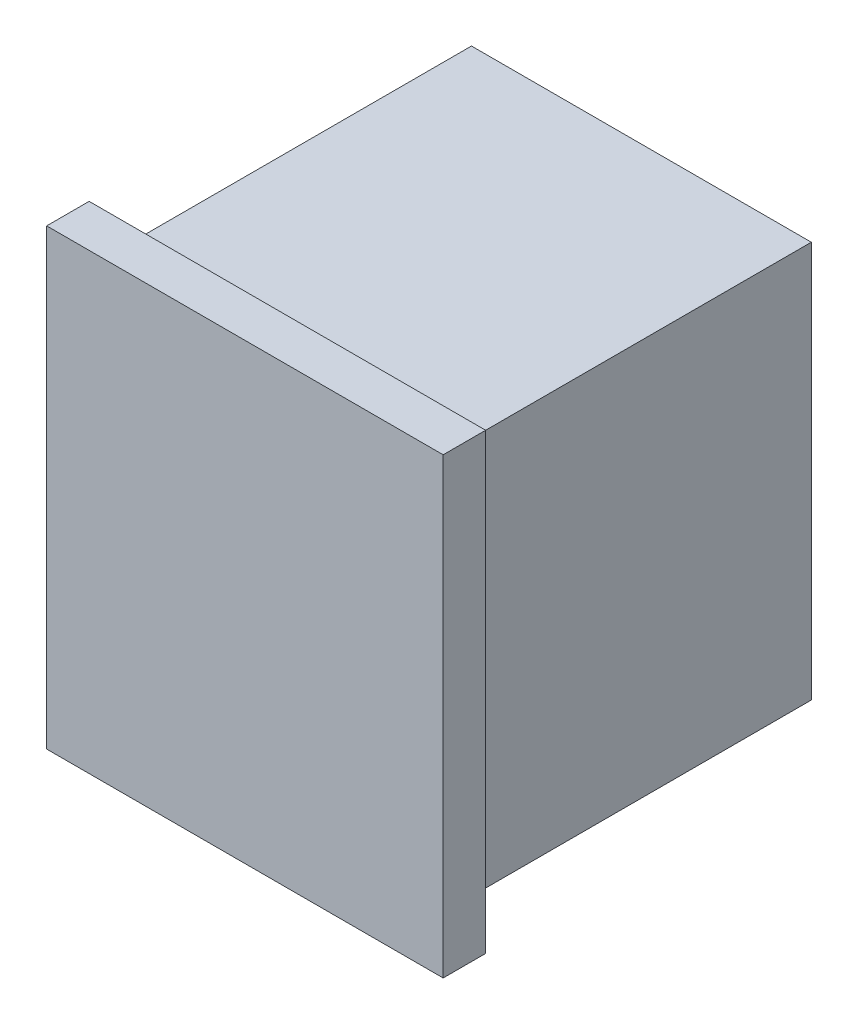
ISO-10303-21;
HEADER;
FILE_DESCRIPTION(('STEP AP214'),'2;1');
FILE_NAME('part.step','',(''),(''),'','','');
FILE_SCHEMA(('AUTOMOTIVE_DESIGN { 1 0 10303 214 1 1 1 1 }'));
ENDSEC;
DATA;
#1=APPLICATION_CONTEXT('core data for automotive mechanical design processes');
#2=APPLICATION_PROTOCOL_DEFINITION('international standard','automotive_design',2000,#1);
#3=PRODUCT_CONTEXT('',#1,'mechanical');
#4=PRODUCT('Part','Part','',(#3));
#5=PRODUCT_RELATED_PRODUCT_CATEGORY('part','',(#4));
#6=PRODUCT_DEFINITION_FORMATION('','',#4);
#7=PRODUCT_DEFINITION_CONTEXT('part definition',#1,'design');
#8=PRODUCT_DEFINITION('design','',#6,#7);
#9=PRODUCT_DEFINITION_SHAPE('','',#8);
#10=(LENGTH_UNIT() NAMED_UNIT(*) SI_UNIT(.MILLI.,.METRE.));
#11=(NAMED_UNIT(*) PLANE_ANGLE_UNIT() SI_UNIT($,.RADIAN.));
#12=(NAMED_UNIT(*) SI_UNIT($,.STERADIAN.) SOLID_ANGLE_UNIT());
#13=UNCERTAINTY_MEASURE_WITH_UNIT(LENGTH_MEASURE(1.E-05),#10,'distance_accuracy_value','');
#14=(GEOMETRIC_REPRESENTATION_CONTEXT(3) GLOBAL_UNCERTAINTY_ASSIGNED_CONTEXT((#13)) GLOBAL_UNIT_ASSIGNED_CONTEXT((#10,
#11,#12)) REPRESENTATION_CONTEXT('',''));
#15=CARTESIAN_POINT('',(0.,0.,0.));
#16=DIRECTION('',(0.,0.,1.));
#17=DIRECTION('',(1.,0.,0.));
#18=AXIS2_PLACEMENT_3D('',#15,#16,#17);
#19=CARTESIAN_POINT('',(0.,0.,0.));
#20=DIRECTION('',(0.,0.,1.));
#21=DIRECTION('',(1.,0.,0.));
#22=AXIS2_PLACEMENT_3D('',#19,#20,#21);
#23=PLANE('',#22);
#24=DIRECTION('',(0.,-1.,0.));
#25=VECTOR('',#24,1.);
#26=CARTESIAN_POINT('',(-14.,-16.,0.));
#27=LINE('',#26,#25);
#28=CARTESIAN_POINT('',(-14.,16.,0.));
#29=VERTEX_POINT('',#28);
#30=CARTESIAN_POINT('',(-14.,-16.,0.));
#31=VERTEX_POINT('',#30);
#32=EDGE_CURVE('E121',#29,#31,#27,.T.);
#33=ORIENTED_EDGE('',*,*,#32,.F.);
#34=DIRECTION('',(-1.,0.,0.));
#35=VECTOR('',#34,1.);
#36=CARTESIAN_POINT('',(14.,16.,0.));
#37=LINE('',#36,#35);
#38=CARTESIAN_POINT('',(14.,16.,0.));
#39=VERTEX_POINT('',#38);
#40=EDGE_CURVE('E134',#39,#29,#37,.T.);
#41=ORIENTED_EDGE('',*,*,#40,.F.);
#42=DIRECTION('',(0.,1.,0.));
#43=VECTOR('',#42,1.);
#44=CARTESIAN_POINT('',(14.,-16.,0.));
#45=LINE('',#44,#43);
#46=CARTESIAN_POINT('',(14.,-16.,0.));
#47=VERTEX_POINT('',#46);
#48=EDGE_CURVE('E142',#47,#39,#45,.T.);
#49=ORIENTED_EDGE('',*,*,#48,.F.);
#50=DIRECTION('',(1.,0.,0.));
#51=VECTOR('',#50,1.);
#52=CARTESIAN_POINT('',(14.,-16.,0.));
#53=LINE('',#52,#51);
#54=EDGE_CURVE('E124',#31,#47,#53,.T.);
#55=ORIENTED_EDGE('',*,*,#54,.F.);
#56=EDGE_LOOP('',(#33,#41,#49,#55));
#57=FACE_BOUND('',#56,.T.);
#58=DIRECTION('',(-1.,0.,0.));
#59=VECTOR('',#58,1.);
#60=CARTESIAN_POINT('',(12.,-14.,0.));
#61=LINE('',#60,#59);
#62=CARTESIAN_POINT('',(12.,-14.,0.));
#63=VERTEX_POINT('',#62);
#64=CARTESIAN_POINT('',(-12.,-14.,0.));
#65=VERTEX_POINT('',#64);
#66=EDGE_CURVE('E120',#63,#65,#61,.T.);
#67=ORIENTED_EDGE('',*,*,#66,.F.);
#68=DIRECTION('',(0.,-1.,0.));
#69=VECTOR('',#68,1.);
#70=CARTESIAN_POINT('',(12.,14.,0.));
#71=LINE('',#70,#69);
#72=CARTESIAN_POINT('',(12.,14.,0.));
#73=VERTEX_POINT('',#72);
#74=EDGE_CURVE('E117',#73,#63,#71,.T.);
#75=ORIENTED_EDGE('',*,*,#74,.F.);
#76=DIRECTION('',(1.,0.,0.));
#77=VECTOR('',#76,1.);
#78=CARTESIAN_POINT('',(-12.,14.,0.));
#79=LINE('',#78,#77);
#80=CARTESIAN_POINT('',(-12.,14.,0.));
#81=VERTEX_POINT('',#80);
#82=EDGE_CURVE('E55',#81,#73,#79,.T.);
#83=ORIENTED_EDGE('',*,*,#82,.F.);
#84=DIRECTION('',(0.,1.,0.));
#85=VECTOR('',#84,1.);
#86=CARTESIAN_POINT('',(-12.,-14.,0.));
#87=LINE('',#86,#85);
#88=EDGE_CURVE('E50',#65,#81,#87,.T.);
#89=ORIENTED_EDGE('',*,*,#88,.F.);
#90=EDGE_LOOP('',(#67,#75,#83,#89));
#91=FACE_BOUND('',#90,.T.);
#92=ADVANCED_FACE('F35',(#57,#91),#23,.F.);
#93=CARTESIAN_POINT('',(-14.,-16.,3.));
#94=DIRECTION('',(1.,0.,0.));
#95=DIRECTION('',(0.,0.,-1.));
#96=AXIS2_PLACEMENT_3D('',#93,#94,#95);
#97=PLANE('',#96);
#98=ORIENTED_EDGE('',*,*,#32,.T.);
#99=DIRECTION('',(0.,0.,-1.));
#100=VECTOR('',#99,1.);
#101=CARTESIAN_POINT('',(-14.,-16.,3.));
#102=LINE('',#101,#100);
#103=CARTESIAN_POINT('',(-14.,-16.,3.));
#104=VERTEX_POINT('',#103);
#105=EDGE_CURVE('E11',#104,#31,#102,.T.);
#106=ORIENTED_EDGE('',*,*,#105,.F.);
#107=DIRECTION('',(0.,-1.,0.));
#108=VECTOR('',#107,1.);
#109=CARTESIAN_POINT('',(-14.,-16.,3.));
#110=LINE('',#109,#108);
#111=CARTESIAN_POINT('',(-14.,16.,3.));
#112=VERTEX_POINT('',#111);
#113=EDGE_CURVE('E130',#112,#104,#110,.T.);
#114=ORIENTED_EDGE('',*,*,#113,.F.);
#115=DIRECTION('',(0.,0.,-1.));
#116=VECTOR('',#115,1.);
#117=CARTESIAN_POINT('',(-14.,16.,3.));
#118=LINE('',#117,#116);
#119=EDGE_CURVE('E139',#112,#29,#118,.T.);
#120=ORIENTED_EDGE('',*,*,#119,.T.);
#121=EDGE_LOOP('',(#98,#106,#114,#120));
#122=FACE_BOUND('',#121,.T.);
#123=ADVANCED_FACE('F37',(#122),#97,.F.);
#124=CARTESIAN_POINT('',(14.,-16.,3.));
#125=DIRECTION('',(0.,1.,0.));
#126=DIRECTION('',(0.,0.,1.));
#127=AXIS2_PLACEMENT_3D('',#124,#125,#126);
#128=PLANE('',#127);
#129=ORIENTED_EDGE('',*,*,#54,.T.);
#130=DIRECTION('',(0.,0.,-1.));
#131=VECTOR('',#130,1.);
#132=CARTESIAN_POINT('',(14.,-16.,3.));
#133=LINE('',#132,#131);
#134=CARTESIAN_POINT('',(14.,-16.,3.));
#135=VERTEX_POINT('',#134);
#136=EDGE_CURVE('E43',#135,#47,#133,.T.);
#137=ORIENTED_EDGE('',*,*,#136,.F.);
#138=DIRECTION('',(1.,0.,0.));
#139=VECTOR('',#138,1.);
#140=CARTESIAN_POINT('',(14.,-16.,3.));
#141=LINE('',#140,#139);
#142=EDGE_CURVE('E133',#104,#135,#141,.T.);
#143=ORIENTED_EDGE('',*,*,#142,.F.);
#144=ORIENTED_EDGE('',*,*,#105,.T.);
#145=EDGE_LOOP('',(#129,#137,#143,#144));
#146=FACE_BOUND('',#145,.T.);
#147=ADVANCED_FACE('F169',(#146),#128,.F.);
#148=CARTESIAN_POINT('',(14.,-16.,3.));
#149=DIRECTION('',(-1.,0.,0.));
#150=DIRECTION('',(0.,0.,1.));
#151=AXIS2_PLACEMENT_3D('',#148,#149,#150);
#152=PLANE('',#151);
#153=ORIENTED_EDGE('',*,*,#48,.T.);
#154=DIRECTION('',(0.,0.,-1.));
#155=VECTOR('',#154,1.);
#156=CARTESIAN_POINT('',(14.,16.,3.));
#157=LINE('',#156,#155);
#158=CARTESIAN_POINT('',(14.,16.,3.));
#159=VERTEX_POINT('',#158);
#160=EDGE_CURVE('E147',#159,#39,#157,.T.);
#161=ORIENTED_EDGE('',*,*,#160,.F.);
#162=DIRECTION('',(0.,1.,0.));
#163=VECTOR('',#162,1.);
#164=CARTESIAN_POINT('',(14.,-16.,3.));
#165=LINE('',#164,#163);
#166=EDGE_CURVE('E136',#135,#159,#165,.T.);
#167=ORIENTED_EDGE('',*,*,#166,.F.);
#168=ORIENTED_EDGE('',*,*,#136,.T.);
#169=EDGE_LOOP('',(#153,#161,#167,#168));
#170=FACE_BOUND('',#169,.T.);
#171=ADVANCED_FACE('F154',(#170),#152,.F.);
#172=CARTESIAN_POINT('',(14.,16.,3.));
#173=DIRECTION('',(0.,-1.,0.));
#174=DIRECTION('',(0.,0.,-1.));
#175=AXIS2_PLACEMENT_3D('',#172,#173,#174);
#176=PLANE('',#175);
#177=ORIENTED_EDGE('',*,*,#40,.T.);
#178=ORIENTED_EDGE('',*,*,#119,.F.);
#179=DIRECTION('',(-1.,0.,0.));
#180=VECTOR('',#179,1.);
#181=CARTESIAN_POINT('',(14.,16.,3.));
#182=LINE('',#181,#180);
#183=EDGE_CURVE('E138',#159,#112,#182,.T.);
#184=ORIENTED_EDGE('',*,*,#183,.F.);
#185=ORIENTED_EDGE('',*,*,#160,.T.);
#186=EDGE_LOOP('',(#177,#178,#184,#185));
#187=FACE_BOUND('',#186,.T.);
#188=ADVANCED_FACE('F162',(#187),#176,.F.);
#189=CARTESIAN_POINT('',(0.,0.,3.));
#190=DIRECTION('',(0.,0.,1.));
#191=DIRECTION('',(1.,0.,0.));
#192=AXIS2_PLACEMENT_3D('',#189,#190,#191);
#193=PLANE('',#192);
#194=ORIENTED_EDGE('',*,*,#113,.T.);
#195=ORIENTED_EDGE('',*,*,#142,.T.);
#196=ORIENTED_EDGE('',*,*,#166,.T.);
#197=ORIENTED_EDGE('',*,*,#183,.T.);
#198=EDGE_LOOP('',(#194,#195,#196,#197));
#199=FACE_BOUND('',#198,.T.);
#200=ADVANCED_FACE('F168',(#199),#193,.T.);
#201=CARTESIAN_POINT('',(12.,-14.,-25.));
#202=DIRECTION('',(0.,1.,0.));
#203=DIRECTION('',(0.,0.,1.));
#204=AXIS2_PLACEMENT_3D('',#201,#202,#203);
#205=PLANE('',#204);
#206=ORIENTED_EDGE('',*,*,#66,.T.);
#207=DIRECTION('',(0.,0.,1.));
#208=VECTOR('',#207,1.);
#209=CARTESIAN_POINT('',(-12.,-14.,-25.));
#210=LINE('',#209,#208);
#211=CARTESIAN_POINT('',(-12.,-14.,-25.));
#212=VERTEX_POINT('',#211);
#213=EDGE_CURVE('E101',#212,#65,#210,.T.);
#214=ORIENTED_EDGE('',*,*,#213,.F.);
#215=DIRECTION('',(-1.,0.,0.));
#216=VECTOR('',#215,1.);
#217=CARTESIAN_POINT('',(12.,-14.,-25.));
#218=LINE('',#217,#216);
#219=CARTESIAN_POINT('',(12.,-14.,-25.));
#220=VERTEX_POINT('',#219);
#221=EDGE_CURVE('E108',#220,#212,#218,.T.);
#222=ORIENTED_EDGE('',*,*,#221,.F.);
#223=DIRECTION('',(0.,0.,1.));
#224=VECTOR('',#223,1.);
#225=CARTESIAN_POINT('',(12.,-14.,-25.));
#226=LINE('',#225,#224);
#227=EDGE_CURVE('E262',#220,#63,#226,.T.);
#228=ORIENTED_EDGE('',*,*,#227,.T.);
#229=EDGE_LOOP('',(#206,#214,#222,#228));
#230=FACE_BOUND('',#229,.T.);
#231=ADVANCED_FACE('F119',(#230),#205,.F.);
#232=CARTESIAN_POINT('',(-12.,-14.,-25.));
#233=DIRECTION('',(1.,0.,0.));
#234=DIRECTION('',(0.,0.,-1.));
#235=AXIS2_PLACEMENT_3D('',#232,#233,#234);
#236=PLANE('',#235);
#237=ORIENTED_EDGE('',*,*,#88,.T.);
#238=DIRECTION('',(0.,0.,1.));
#239=VECTOR('',#238,1.);
#240=CARTESIAN_POINT('',(-12.,14.,-25.));
#241=LINE('',#240,#239);
#242=CARTESIAN_POINT('',(-12.,14.,-25.));
#243=VERTEX_POINT('',#242);
#244=EDGE_CURVE('E104',#243,#81,#241,.T.);
#245=ORIENTED_EDGE('',*,*,#244,.F.);
#246=DIRECTION('',(0.,1.,0.));
#247=VECTOR('',#246,1.);
#248=CARTESIAN_POINT('',(-12.,-14.,-25.));
#249=LINE('',#248,#247);
#250=EDGE_CURVE('E97',#212,#243,#249,.T.);
#251=ORIENTED_EDGE('',*,*,#250,.F.);
#252=ORIENTED_EDGE('',*,*,#213,.T.);
#253=EDGE_LOOP('',(#237,#245,#251,#252));
#254=FACE_BOUND('',#253,.T.);
#255=ADVANCED_FACE('F99',(#254),#236,.F.);
#256=CARTESIAN_POINT('',(-12.,14.,-25.));
#257=DIRECTION('',(0.,-1.,0.));
#258=DIRECTION('',(0.,0.,-1.));
#259=AXIS2_PLACEMENT_3D('',#256,#257,#258);
#260=PLANE('',#259);
#261=ORIENTED_EDGE('',*,*,#82,.T.);
#262=DIRECTION('',(0.,0.,1.));
#263=VECTOR('',#262,1.);
#264=CARTESIAN_POINT('',(12.,14.,-25.));
#265=LINE('',#264,#263);
#266=CARTESIAN_POINT('',(12.,14.,-25.));
#267=VERTEX_POINT('',#266);
#268=EDGE_CURVE('E126',#267,#73,#265,.T.);
#269=ORIENTED_EDGE('',*,*,#268,.F.);
#270=DIRECTION('',(1.,0.,0.));
#271=VECTOR('',#270,1.);
#272=CARTESIAN_POINT('',(-12.,14.,-25.));
#273=LINE('',#272,#271);
#274=EDGE_CURVE('E107',#243,#267,#273,.T.);
#275=ORIENTED_EDGE('',*,*,#274,.F.);
#276=ORIENTED_EDGE('',*,*,#244,.T.);
#277=EDGE_LOOP('',(#261,#269,#275,#276));
#278=FACE_BOUND('',#277,.T.);
#279=ADVANCED_FACE('F193',(#278),#260,.F.);
#280=CARTESIAN_POINT('',(12.,14.,-25.));
#281=DIRECTION('',(-1.,0.,0.));
#282=DIRECTION('',(0.,0.,1.));
#283=AXIS2_PLACEMENT_3D('',#280,#281,#282);
#284=PLANE('',#283);
#285=ORIENTED_EDGE('',*,*,#74,.T.);
#286=ORIENTED_EDGE('',*,*,#227,.F.);
#287=DIRECTION('',(0.,-1.,0.));
#288=VECTOR('',#287,1.);
#289=CARTESIAN_POINT('',(12.,14.,-25.));
#290=LINE('',#289,#288);
#291=EDGE_CURVE('E113',#267,#220,#290,.T.);
#292=ORIENTED_EDGE('',*,*,#291,.F.);
#293=ORIENTED_EDGE('',*,*,#268,.T.);
#294=EDGE_LOOP('',(#285,#286,#292,#293));
#295=FACE_BOUND('',#294,.T.);
#296=ADVANCED_FACE('F198',(#295),#284,.F.);
#297=CARTESIAN_POINT('',(0.,0.,-25.));
#298=DIRECTION('',(0.,0.,-1.));
#299=DIRECTION('',(-1.,0.,0.));
#300=AXIS2_PLACEMENT_3D('',#297,#298,#299);
#301=PLANE('',#300);
#302=ORIENTED_EDGE('',*,*,#221,.T.);
#303=ORIENTED_EDGE('',*,*,#250,.T.);
#304=ORIENTED_EDGE('',*,*,#274,.T.);
#305=ORIENTED_EDGE('',*,*,#291,.T.);
#306=EDGE_LOOP('',(#302,#303,#304,#305));
#307=FACE_BOUND('',#306,.T.);
#308=ADVANCED_FACE('F111',(#307),#301,.T.);
#309=CLOSED_SHELL('',(#92,#123,#147,#171,#188,#200,#231,#255,#279,#296,#308));
#310=MANIFOLD_SOLID_BREP('B2',#309);
#311=ADVANCED_BREP_SHAPE_REPRESENTATION('',(#18,#310),#14);
#312=SHAPE_DEFINITION_REPRESENTATION(#9,#311);
ENDSEC;
END-ISO-10303-21;
